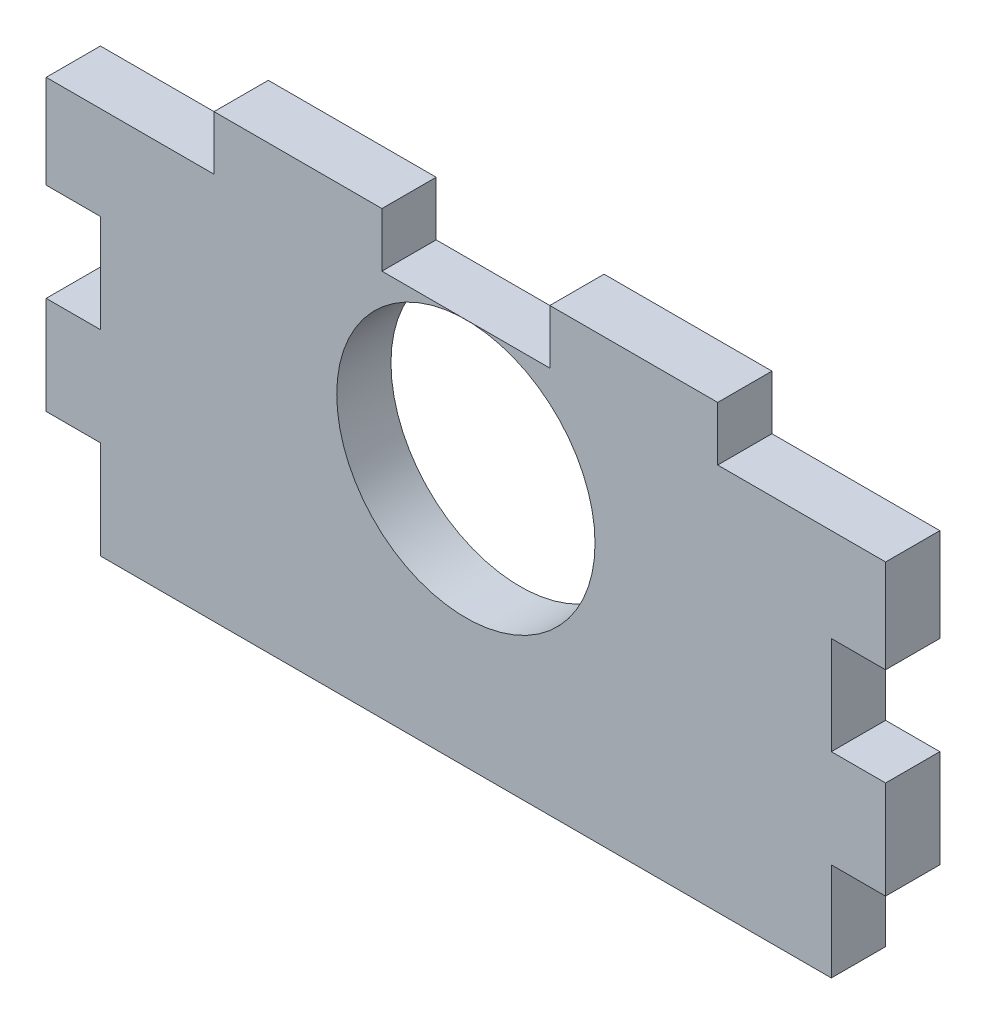
ISO-10303-21;
HEADER;
FILE_DESCRIPTION(('STEP AP214'),'2;1');
FILE_NAME('part.step','',(''),(''),'','','');
FILE_SCHEMA(('AUTOMOTIVE_DESIGN { 1 0 10303 214 1 1 1 1 }'));
ENDSEC;
DATA;
#1=APPLICATION_CONTEXT('core data for automotive mechanical design processes');
#2=APPLICATION_PROTOCOL_DEFINITION('international standard','automotive_design',2000,#1);
#3=PRODUCT_CONTEXT('',#1,'mechanical');
#4=PRODUCT('Part','Part','',(#3));
#5=PRODUCT_RELATED_PRODUCT_CATEGORY('part','',(#4));
#6=PRODUCT_DEFINITION_FORMATION('','',#4);
#7=PRODUCT_DEFINITION_CONTEXT('part definition',#1,'design');
#8=PRODUCT_DEFINITION('design','',#6,#7);
#9=PRODUCT_DEFINITION_SHAPE('','',#8);
#10=(LENGTH_UNIT() NAMED_UNIT(*) SI_UNIT(.MILLI.,.METRE.));
#11=(NAMED_UNIT(*) PLANE_ANGLE_UNIT() SI_UNIT($,.RADIAN.));
#12=(NAMED_UNIT(*) SI_UNIT($,.STERADIAN.) SOLID_ANGLE_UNIT());
#13=UNCERTAINTY_MEASURE_WITH_UNIT(LENGTH_MEASURE(1.E-05),#10,'distance_accuracy_value','');
#14=(GEOMETRIC_REPRESENTATION_CONTEXT(3) GLOBAL_UNCERTAINTY_ASSIGNED_CONTEXT((#13)) GLOBAL_UNIT_ASSIGNED_CONTEXT((#10,
#11,#12)) REPRESENTATION_CONTEXT('',''));
#15=CARTESIAN_POINT('',(0.,0.,0.));
#16=DIRECTION('',(0.,0.,1.));
#17=DIRECTION('',(1.,0.,0.));
#18=AXIS2_PLACEMENT_3D('',#15,#16,#17);
#19=CARTESIAN_POINT('',(-5.53524932452526,14.1108572179902,5.334));
#20=DIRECTION('',(-1.,0.,0.));
#21=DIRECTION('',(0.,0.,1.));
#22=AXIS2_PLACEMENT_3D('',#19,#20,#21);
#23=PLANE('',#22);
#24=DIRECTION('',(0.,1.,0.));
#25=VECTOR('',#24,1.);
#26=CARTESIAN_POINT('',(-5.53524932452526,14.1108572179902,5.334));
#27=LINE('',#26,#25);
#28=CARTESIAN_POINT('',(-5.53524932452527,-0.408183250673118,5.334));
#29=VERTEX_POINT('',#28);
#30=CARTESIAN_POINT('',(-5.53524932452526,8.77685721799016,5.334));
#31=VERTEX_POINT('',#30);
#32=EDGE_CURVE('E371',#29,#31,#27,.T.);
#33=ORIENTED_EDGE('',*,*,#32,.F.);
#34=DIRECTION('',(0.,0.,1.));
#35=VECTOR('',#34,1.);
#36=CARTESIAN_POINT('',(-5.53524932452527,-0.408183250673118,0.));
#37=LINE('',#36,#35);
#38=CARTESIAN_POINT('',(-5.53524932452527,-0.408183250673118,0.));
#39=VERTEX_POINT('',#38);
#40=EDGE_CURVE('E232',#39,#29,#37,.T.);
#41=ORIENTED_EDGE('',*,*,#40,.F.);
#42=DIRECTION('',(0.,1.,0.));
#43=VECTOR('',#42,1.);
#44=CARTESIAN_POINT('',(-5.53524932452526,14.1108572179902,0.));
#45=LINE('',#44,#43);
#46=CARTESIAN_POINT('',(-5.53524932452526,8.77685721799016,0.));
#47=VERTEX_POINT('',#46);
#48=EDGE_CURVE('E219',#39,#47,#45,.T.);
#49=ORIENTED_EDGE('',*,*,#48,.T.);
#50=DIRECTION('',(0.,0.,1.));
#51=VECTOR('',#50,1.);
#52=CARTESIAN_POINT('',(-5.53524932452526,8.77685721799016,0.));
#53=LINE('',#52,#51);
#54=EDGE_CURVE('E314',#47,#31,#53,.T.);
#55=ORIENTED_EDGE('',*,*,#54,.T.);
#56=EDGE_LOOP('',(#33,#41,#49,#55));
#57=FACE_BOUND('',#56,.T.);
#58=ADVANCED_FACE('F37',(#57),#23,.F.);
#59=CARTESIAN_POINT('',(-88.0852493245253,14.1108572179902,5.334));
#60=DIRECTION('',(1.,0.,0.));
#61=DIRECTION('',(0.,0.,-1.));
#62=AXIS2_PLACEMENT_3D('',#59,#60,#61);
#63=PLANE('',#62);
#64=DIRECTION('',(0.,-1.,0.));
#65=VECTOR('',#64,1.);
#66=CARTESIAN_POINT('',(-88.0852493245253,14.1108572179902,0.));
#67=LINE('',#66,#65);
#68=CARTESIAN_POINT('',(-88.0852493245253,8.77685721799016,0.));
#69=VERTEX_POINT('',#68);
#70=CARTESIAN_POINT('',(-88.0852493245253,-0.408183250673128,0.));
#71=VERTEX_POINT('',#70);
#72=EDGE_CURVE('E375',#69,#71,#67,.T.);
#73=ORIENTED_EDGE('',*,*,#72,.T.);
#74=DIRECTION('',(0.,0.,1.));
#75=VECTOR('',#74,1.);
#76=CARTESIAN_POINT('',(-88.0852493245253,-0.408183250673128,0.));
#77=LINE('',#76,#75);
#78=CARTESIAN_POINT('',(-88.0852493245253,-0.408183250673128,5.334));
#79=VERTEX_POINT('',#78);
#80=EDGE_CURVE('E272',#71,#79,#77,.T.);
#81=ORIENTED_EDGE('',*,*,#80,.T.);
#82=DIRECTION('',(0.,-1.,0.));
#83=VECTOR('',#82,1.);
#84=CARTESIAN_POINT('',(-88.0852493245253,14.1108572179902,5.334));
#85=LINE('',#84,#83);
#86=CARTESIAN_POINT('',(-88.0852493245253,8.77685721799016,5.334));
#87=VERTEX_POINT('',#86);
#88=EDGE_CURVE('E364',#87,#79,#85,.T.);
#89=ORIENTED_EDGE('',*,*,#88,.F.);
#90=DIRECTION('',(0.,0.,1.));
#91=VECTOR('',#90,1.);
#92=CARTESIAN_POINT('',(-88.0852493245253,8.77685721799016,0.));
#93=LINE('',#92,#91);
#94=EDGE_CURVE('E352',#69,#87,#93,.T.);
#95=ORIENTED_EDGE('',*,*,#94,.F.);
#96=EDGE_LOOP('',(#73,#81,#89,#95));
#97=FACE_BOUND('',#96,.T.);
#98=ADVANCED_FACE('F431',(#97),#63,.F.);
#99=CARTESIAN_POINT('',(-88.0852493245253,14.1108572179902,5.334));
#100=DIRECTION('',(0.,-1.,0.));
#101=DIRECTION('',(0.,0.,-1.));
#102=AXIS2_PLACEMENT_3D('',#99,#100,#101);
#103=PLANE('',#102);
#104=DIRECTION('',(-1.,0.,0.));
#105=VECTOR('',#104,1.);
#106=CARTESIAN_POINT('',(-88.0852493245253,14.1108572179902,5.334));
#107=LINE('',#106,#105);
#108=CARTESIAN_POINT('',(-55.0652493245253,14.1108572179902,5.334));
#109=VERTEX_POINT('',#108);
#110=CARTESIAN_POINT('',(-71.5752493245253,14.1108572179902,5.334));
#111=VERTEX_POINT('',#110);
#112=EDGE_CURVE('E46',#109,#111,#107,.T.);
#113=ORIENTED_EDGE('',*,*,#112,.F.);
#114=DIRECTION('',(0.,0.,1.));
#115=VECTOR('',#114,1.);
#116=CARTESIAN_POINT('',(-55.0652493245253,14.1108572179902,0.));
#117=LINE('',#116,#115);
#118=CARTESIAN_POINT('',(-55.0652493245253,14.1108572179902,0.));
#119=VERTEX_POINT('',#118);
#120=EDGE_CURVE('E336',#119,#109,#117,.T.);
#121=ORIENTED_EDGE('',*,*,#120,.F.);
#122=DIRECTION('',(-1.,0.,0.));
#123=VECTOR('',#122,1.);
#124=CARTESIAN_POINT('',(-88.0852493245253,14.1108572179902,0.));
#125=LINE('',#124,#123);
#126=CARTESIAN_POINT('',(-71.5752493245253,14.1108572179902,0.));
#127=VERTEX_POINT('',#126);
#128=EDGE_CURVE('E382',#119,#127,#125,.T.);
#129=ORIENTED_EDGE('',*,*,#128,.T.);
#130=DIRECTION('',(0.,0.,1.));
#131=VECTOR('',#130,1.);
#132=CARTESIAN_POINT('',(-71.5752493245253,14.1108572179902,0.));
#133=LINE('',#132,#131);
#134=EDGE_CURVE('E357',#127,#111,#133,.T.);
#135=ORIENTED_EDGE('',*,*,#134,.T.);
#136=EDGE_LOOP('',(#113,#121,#129,#135));
#137=FACE_BOUND('',#136,.T.);
#138=ADVANCED_FACE('F418',(#137),#103,.F.);
#139=CARTESIAN_POINT('',(-88.0852493245253,-10.046503094452,5.334));
#140=VERTEX_POINT('',#139);
#141=CARTESIAN_POINT('',(-88.0852493245253,-19.6848229382309,5.334));
#142=VERTEX_POINT('',#141);
#143=EDGE_CURVE('E368',#140,#142,#85,.T.);
#144=ORIENTED_EDGE('',*,*,#143,.F.);
#145=DIRECTION('',(0.,0.,1.));
#146=VECTOR('',#145,1.);
#147=CARTESIAN_POINT('',(-88.0852493245253,-10.046503094452,0.));
#148=LINE('',#147,#146);
#149=CARTESIAN_POINT('',(-88.0852493245253,-10.046503094452,0.));
#150=VERTEX_POINT('',#149);
#151=EDGE_CURVE('E265',#150,#140,#148,.T.);
#152=ORIENTED_EDGE('',*,*,#151,.F.);
#153=CARTESIAN_POINT('',(-88.0852493245253,-19.6848229382309,0.));
#154=VERTEX_POINT('',#153);
#155=EDGE_CURVE('E360',#150,#154,#67,.T.);
#156=ORIENTED_EDGE('',*,*,#155,.T.);
#157=DIRECTION('',(0.,0.,1.));
#158=VECTOR('',#157,1.);
#159=CARTESIAN_POINT('',(-88.0852493245253,-19.6848229382309,0.));
#160=LINE('',#159,#158);
#161=EDGE_CURVE('E293',#154,#142,#160,.T.);
#162=ORIENTED_EDGE('',*,*,#161,.T.);
#163=EDGE_LOOP('',(#144,#152,#156,#162));
#164=FACE_BOUND('',#163,.T.);
#165=ADVANCED_FACE('F39',(#164),#63,.F.);
#166=CARTESIAN_POINT('',(-88.0852493245253,-29.3231427820098,5.334));
#167=DIRECTION('',(0.,1.,0.));
#168=DIRECTION('',(0.,0.,1.));
#169=AXIS2_PLACEMENT_3D('',#166,#167,#168);
#170=PLANE('',#169);
#171=DIRECTION('',(1.,0.,0.));
#172=VECTOR('',#171,1.);
#173=CARTESIAN_POINT('',(-88.0852493245253,-29.3231427820098,0.));
#174=LINE('',#173,#172);
#175=CARTESIAN_POINT('',(-82.7512493245252,-29.3231427820098,0.));
#176=VERTEX_POINT('',#175);
#177=CARTESIAN_POINT('',(-10.8692493245253,-29.3231427820098,0.));
#178=VERTEX_POINT('',#177);
#179=EDGE_CURVE('E378',#176,#178,#174,.T.);
#180=ORIENTED_EDGE('',*,*,#179,.T.);
#181=DIRECTION('',(0.,0.,1.));
#182=VECTOR('',#181,1.);
#183=CARTESIAN_POINT('',(-10.8692493245253,-29.3231427820098,0.));
#184=LINE('',#183,#182);
#185=CARTESIAN_POINT('',(-10.8692493245253,-29.3231427820098,5.334));
#186=VERTEX_POINT('',#185);
#187=EDGE_CURVE('E248',#178,#186,#184,.T.);
#188=ORIENTED_EDGE('',*,*,#187,.T.);
#189=DIRECTION('',(1.,0.,0.));
#190=VECTOR('',#189,1.);
#191=CARTESIAN_POINT('',(-88.0852493245253,-29.3231427820098,5.334));
#192=LINE('',#191,#190);
#193=CARTESIAN_POINT('',(-82.7512493245252,-29.3231427820098,5.334));
#194=VERTEX_POINT('',#193);
#195=EDGE_CURVE('E367',#194,#186,#192,.T.);
#196=ORIENTED_EDGE('',*,*,#195,.F.);
#197=DIRECTION('',(0.,0.,1.));
#198=VECTOR('',#197,1.);
#199=CARTESIAN_POINT('',(-82.7512493245252,-29.3231427820098,0.));
#200=LINE('',#199,#198);
#201=EDGE_CURVE('E288',#176,#194,#200,.T.);
#202=ORIENTED_EDGE('',*,*,#201,.F.);
#203=EDGE_LOOP('',(#180,#188,#196,#202));
#204=FACE_BOUND('',#203,.T.);
#205=ADVANCED_FACE('F459',(#204),#170,.F.);
#206=CARTESIAN_POINT('',(-5.53524932452526,-19.6848229382309,0.));
#207=VERTEX_POINT('',#206);
#208=CARTESIAN_POINT('',(-5.53524932452527,-10.046503094452,0.));
#209=VERTEX_POINT('',#208);
#210=EDGE_CURVE('E380',#207,#209,#45,.T.);
#211=ORIENTED_EDGE('',*,*,#210,.T.);
#212=DIRECTION('',(0.,0.,1.));
#213=VECTOR('',#212,1.);
#214=CARTESIAN_POINT('',(-5.53524932452527,-10.046503094452,0.));
#215=LINE('',#214,#213);
#216=CARTESIAN_POINT('',(-5.53524932452527,-10.046503094452,5.334));
#217=VERTEX_POINT('',#216);
#218=EDGE_CURVE('E235',#209,#217,#215,.T.);
#219=ORIENTED_EDGE('',*,*,#218,.T.);
#220=CARTESIAN_POINT('',(-5.53524932452526,-19.6848229382309,5.334));
#221=VERTEX_POINT('',#220);
#222=EDGE_CURVE('E372',#221,#217,#27,.T.);
#223=ORIENTED_EDGE('',*,*,#222,.F.);
#224=DIRECTION('',(0.,0.,1.));
#225=VECTOR('',#224,1.);
#226=CARTESIAN_POINT('',(-5.53524932452526,-19.6848229382309,0.));
#227=LINE('',#226,#225);
#228=EDGE_CURVE('E244',#207,#221,#227,.T.);
#229=ORIENTED_EDGE('',*,*,#228,.F.);
#230=EDGE_LOOP('',(#211,#219,#223,#229));
#231=FACE_BOUND('',#230,.T.);
#232=ADVANCED_FACE('F466',(#231),#23,.F.);
#233=CARTESIAN_POINT('',(-22.0452493245253,14.1108572179902,5.334));
#234=VERTEX_POINT('',#233);
#235=CARTESIAN_POINT('',(-38.5552493245253,14.1108572179902,5.334));
#236=VERTEX_POINT('',#235);
#237=EDGE_CURVE('E11',#234,#236,#107,.T.);
#238=ORIENTED_EDGE('',*,*,#237,.F.);
#239=DIRECTION('',(0.,0.,1.));
#240=VECTOR('',#239,1.);
#241=CARTESIAN_POINT('',(-22.0452493245253,14.1108572179902,0.));
#242=LINE('',#241,#240);
#243=CARTESIAN_POINT('',(-22.0452493245253,14.1108572179902,0.));
#244=VERTEX_POINT('',#243);
#245=EDGE_CURVE('E311',#244,#234,#242,.T.);
#246=ORIENTED_EDGE('',*,*,#245,.F.);
#247=CARTESIAN_POINT('',(-38.5552493245253,14.1108572179902,0.));
#248=VERTEX_POINT('',#247);
#249=EDGE_CURVE('E41',#244,#248,#125,.T.);
#250=ORIENTED_EDGE('',*,*,#249,.T.);
#251=DIRECTION('',(0.,0.,1.));
#252=VECTOR('',#251,1.);
#253=CARTESIAN_POINT('',(-38.5552493245253,14.1108572179902,0.));
#254=LINE('',#253,#252);
#255=EDGE_CURVE('E339',#248,#236,#254,.T.);
#256=ORIENTED_EDGE('',*,*,#255,.T.);
#257=EDGE_LOOP('',(#238,#246,#250,#256));
#258=FACE_BOUND('',#257,.T.);
#259=ADVANCED_FACE('F400',(#258),#103,.F.);
#260=CARTESIAN_POINT('',(0.,0.,5.334));
#261=DIRECTION('',(0.,0.,1.));
#262=DIRECTION('',(1.,0.,0.));
#263=AXIS2_PLACEMENT_3D('',#260,#261,#262);
#264=PLANE('',#263);
#265=CARTESIAN_POINT('',(-46.8102493245253,-3.92339678200984,5.334));
#266=DIRECTION('',(0.,0.,1.));
#267=DIRECTION('',(1.,0.,0.));
#268=AXIS2_PLACEMENT_3D('',#265,#266,#267);
#269=CIRCLE('',#268,12.7);
#270=CARTESIAN_POINT('',(-34.1102493245252,-3.92339678200984,5.334));
#271=VERTEX_POINT('',#270);
#272=EDGE_CURVE('E225',#271,#271,#269,.T.);
#273=ORIENTED_EDGE('',*,*,#272,.F.);
#274=EDGE_LOOP('',(#273));
#275=FACE_BOUND('',#274,.T.);
#276=DIRECTION('',(-1.,0.,0.));
#277=VECTOR('',#276,1.);
#278=CARTESIAN_POINT('',(-5.53524932452527,-0.408183250673118,5.334));
#279=LINE('',#278,#277);
#280=CARTESIAN_POINT('',(-10.8692493245253,-0.408183250673119,5.334));
#281=VERTEX_POINT('',#280);
#282=EDGE_CURVE('E205',#29,#281,#279,.T.);
#283=ORIENTED_EDGE('',*,*,#282,.F.);
#284=ORIENTED_EDGE('',*,*,#32,.T.);
#285=DIRECTION('',(1.,0.,0.));
#286=VECTOR('',#285,1.);
#287=CARTESIAN_POINT('',(-22.0452493245253,8.77685721799016,5.334));
#288=LINE('',#287,#286);
#289=CARTESIAN_POINT('',(-22.0452493245253,8.77685721799016,5.334));
#290=VERTEX_POINT('',#289);
#291=EDGE_CURVE('E304',#290,#31,#288,.T.);
#292=ORIENTED_EDGE('',*,*,#291,.F.);
#293=DIRECTION('',(0.,-1.,0.));
#294=VECTOR('',#293,1.);
#295=CARTESIAN_POINT('',(-22.0452493245253,14.1108572179902,5.334));
#296=LINE('',#295,#294);
#297=EDGE_CURVE('E296',#234,#290,#296,.T.);
#298=ORIENTED_EDGE('',*,*,#297,.F.);
#299=ORIENTED_EDGE('',*,*,#237,.T.);
#300=DIRECTION('',(0.,1.,0.));
#301=VECTOR('',#300,1.);
#302=CARTESIAN_POINT('',(-38.5552493245253,14.1108572179902,5.334));
#303=LINE('',#302,#301);
#304=CARTESIAN_POINT('',(-38.5552493245253,8.77685721799016,5.334));
#305=VERTEX_POINT('',#304);
#306=EDGE_CURVE('E322',#305,#236,#303,.T.);
#307=ORIENTED_EDGE('',*,*,#306,.F.);
#308=DIRECTION('',(1.,0.,0.));
#309=VECTOR('',#308,1.);
#310=CARTESIAN_POINT('',(-55.0652493245253,8.77685721799016,5.334));
#311=LINE('',#310,#309);
#312=CARTESIAN_POINT('',(-55.0652493245253,8.77685721799016,5.334));
#313=VERTEX_POINT('',#312);
#314=EDGE_CURVE('E331',#313,#305,#311,.T.);
#315=ORIENTED_EDGE('',*,*,#314,.F.);
#316=DIRECTION('',(0.,-1.,0.));
#317=VECTOR('',#316,1.);
#318=CARTESIAN_POINT('',(-55.0652493245253,14.1108572179902,5.334));
#319=LINE('',#318,#317);
#320=EDGE_CURVE('E313',#109,#313,#319,.T.);
#321=ORIENTED_EDGE('',*,*,#320,.F.);
#322=ORIENTED_EDGE('',*,*,#112,.T.);
#323=DIRECTION('',(0.,1.,0.));
#324=VECTOR('',#323,1.);
#325=CARTESIAN_POINT('',(-71.5752493245253,14.1108572179902,5.334));
#326=LINE('',#325,#324);
#327=CARTESIAN_POINT('',(-71.5752493245253,8.77685721799016,5.334));
#328=VERTEX_POINT('',#327);
#329=EDGE_CURVE('E349',#328,#111,#326,.T.);
#330=ORIENTED_EDGE('',*,*,#329,.F.);
#331=DIRECTION('',(1.,0.,0.));
#332=VECTOR('',#331,1.);
#333=CARTESIAN_POINT('',(-88.0852493245253,8.77685721799016,5.334));
#334=LINE('',#333,#332);
#335=EDGE_CURVE('E338',#87,#328,#334,.T.);
#336=ORIENTED_EDGE('',*,*,#335,.F.);
#337=ORIENTED_EDGE('',*,*,#88,.T.);
#338=DIRECTION('',(-1.,0.,0.));
#339=VECTOR('',#338,1.);
#340=CARTESIAN_POINT('',(-88.0852493245253,-0.408183250673128,5.334));
#341=LINE('',#340,#339);
#342=CARTESIAN_POINT('',(-82.7512493245252,-0.408183250673128,5.334));
#343=VERTEX_POINT('',#342);
#344=EDGE_CURVE('E259',#343,#79,#341,.T.);
#345=ORIENTED_EDGE('',*,*,#344,.F.);
#346=DIRECTION('',(0.,1.,0.));
#347=VECTOR('',#346,1.);
#348=CARTESIAN_POINT('',(-82.7512493245252,-0.408183250673128,5.334));
#349=LINE('',#348,#347);
#350=CARTESIAN_POINT('',(-82.7512493245252,-10.046503094452,5.334));
#351=VERTEX_POINT('',#350);
#352=EDGE_CURVE('E268',#351,#343,#349,.T.);
#353=ORIENTED_EDGE('',*,*,#352,.F.);
#354=DIRECTION('',(1.,0.,0.));
#355=VECTOR('',#354,1.);
#356=CARTESIAN_POINT('',(-88.0852493245253,-10.046503094452,5.334));
#357=LINE('',#356,#355);
#358=EDGE_CURVE('E251',#140,#351,#357,.T.);
#359=ORIENTED_EDGE('',*,*,#358,.F.);
#360=ORIENTED_EDGE('',*,*,#143,.T.);
#361=DIRECTION('',(-1.,0.,0.));
#362=VECTOR('',#361,1.);
#363=CARTESIAN_POINT('',(-88.0852493245253,-19.6848229382309,5.334));
#364=LINE('',#363,#362);
#365=CARTESIAN_POINT('',(-82.7512493245252,-19.6848229382309,5.334));
#366=VERTEX_POINT('',#365);
#367=EDGE_CURVE('E285',#366,#142,#364,.T.);
#368=ORIENTED_EDGE('',*,*,#367,.F.);
#369=DIRECTION('',(0.,1.,0.));
#370=VECTOR('',#369,1.);
#371=CARTESIAN_POINT('',(-82.7512493245252,-29.3231427820098,5.334));
#372=LINE('',#371,#370);
#373=EDGE_CURVE('E275',#194,#366,#372,.T.);
#374=ORIENTED_EDGE('',*,*,#373,.F.);
#375=ORIENTED_EDGE('',*,*,#195,.T.);
#376=DIRECTION('',(0.,-1.,0.));
#377=VECTOR('',#376,1.);
#378=CARTESIAN_POINT('',(-10.8692493245253,-29.3231427820098,5.334));
#379=LINE('',#378,#377);
#380=CARTESIAN_POINT('',(-10.8692493245253,-19.6848229382309,5.334));
#381=VERTEX_POINT('',#380);
#382=EDGE_CURVE('E242',#381,#186,#379,.T.);
#383=ORIENTED_EDGE('',*,*,#382,.F.);
#384=DIRECTION('',(-1.,0.,0.));
#385=VECTOR('',#384,1.);
#386=CARTESIAN_POINT('',(-5.53524932452526,-19.6848229382309,5.334));
#387=LINE('',#386,#385);
#388=EDGE_CURVE('E234',#221,#381,#387,.T.);
#389=ORIENTED_EDGE('',*,*,#388,.F.);
#390=ORIENTED_EDGE('',*,*,#222,.T.);
#391=DIRECTION('',(1.,0.,0.));
#392=VECTOR('',#391,1.);
#393=CARTESIAN_POINT('',(-5.53524932452527,-10.046503094452,5.334));
#394=LINE('',#393,#392);
#395=CARTESIAN_POINT('',(-10.8692493245253,-10.046503094452,5.334));
#396=VERTEX_POINT('',#395);
#397=EDGE_CURVE('E220',#396,#217,#394,.T.);
#398=ORIENTED_EDGE('',*,*,#397,.F.);
#399=DIRECTION('',(0.,-1.,0.));
#400=VECTOR('',#399,1.);
#401=CARTESIAN_POINT('',(-10.8692493245253,-0.408183250673119,5.334));
#402=LINE('',#401,#400);
#403=EDGE_CURVE('E222',#281,#396,#402,.T.);
#404=ORIENTED_EDGE('',*,*,#403,.F.);
#405=EDGE_LOOP('',(#283,#284,#292,#298,#299,#307,#315,#321,#322,#330,#336,#337,#345,#353,#359,
#360,#368,#374,#375,#383,#389,#390,#398,#404));
#406=FACE_BOUND('',#405,.T.);
#407=ADVANCED_FACE('F404',(#275,#406),#264,.T.);
#408=CARTESIAN_POINT('',(0.,0.,0.));
#409=DIRECTION('',(0.,0.,1.));
#410=DIRECTION('',(1.,0.,0.));
#411=AXIS2_PLACEMENT_3D('',#408,#409,#410);
#412=PLANE('',#411);
#413=CARTESIAN_POINT('',(-46.8102493245253,-3.92339678200984,0.));
#414=DIRECTION('',(0.,0.,1.));
#415=DIRECTION('',(1.,0.,0.));
#416=AXIS2_PLACEMENT_3D('',#413,#414,#415);
#417=CIRCLE('',#416,12.7);
#418=CARTESIAN_POINT('',(-34.1102493245252,-3.92339678200984,0.));
#419=VERTEX_POINT('',#418);
#420=EDGE_CURVE('E230',#419,#419,#417,.T.);
#421=ORIENTED_EDGE('',*,*,#420,.T.);
#422=EDGE_LOOP('',(#421));
#423=FACE_BOUND('',#422,.T.);
#424=ORIENTED_EDGE('',*,*,#48,.F.);
#425=DIRECTION('',(-1.,0.,0.));
#426=VECTOR('',#425,1.);
#427=CARTESIAN_POINT('',(-5.53524932452527,-0.408183250673118,0.));
#428=LINE('',#427,#426);
#429=CARTESIAN_POINT('',(-10.8692493245253,-0.408183250673119,0.));
#430=VERTEX_POINT('',#429);
#431=EDGE_CURVE('E202',#39,#430,#428,.T.);
#432=ORIENTED_EDGE('',*,*,#431,.T.);
#433=DIRECTION('',(0.,-1.,0.));
#434=VECTOR('',#433,1.);
#435=CARTESIAN_POINT('',(-10.8692493245253,-0.408183250673119,0.));
#436=LINE('',#435,#434);
#437=CARTESIAN_POINT('',(-10.8692493245253,-10.046503094452,0.));
#438=VERTEX_POINT('',#437);
#439=EDGE_CURVE('E212',#430,#438,#436,.T.);
#440=ORIENTED_EDGE('',*,*,#439,.T.);
#441=DIRECTION('',(1.,0.,0.));
#442=VECTOR('',#441,1.);
#443=CARTESIAN_POINT('',(-5.53524932452527,-10.046503094452,0.));
#444=LINE('',#443,#442);
#445=EDGE_CURVE('E54',#438,#209,#444,.T.);
#446=ORIENTED_EDGE('',*,*,#445,.T.);
#447=ORIENTED_EDGE('',*,*,#210,.F.);
#448=DIRECTION('',(-1.,0.,0.));
#449=VECTOR('',#448,1.);
#450=CARTESIAN_POINT('',(-5.53524932452526,-19.6848229382309,0.));
#451=LINE('',#450,#449);
#452=CARTESIAN_POINT('',(-10.8692493245253,-19.6848229382309,0.));
#453=VERTEX_POINT('',#452);
#454=EDGE_CURVE('E239',#207,#453,#451,.T.);
#455=ORIENTED_EDGE('',*,*,#454,.T.);
#456=DIRECTION('',(0.,-1.,0.));
#457=VECTOR('',#456,1.);
#458=CARTESIAN_POINT('',(-10.8692493245253,-29.3231427820098,0.));
#459=LINE('',#458,#457);
#460=EDGE_CURVE('E62',#453,#178,#459,.T.);
#461=ORIENTED_EDGE('',*,*,#460,.T.);
#462=ORIENTED_EDGE('',*,*,#179,.F.);
#463=DIRECTION('',(0.,1.,0.));
#464=VECTOR('',#463,1.);
#465=CARTESIAN_POINT('',(-82.7512493245252,-29.3231427820098,0.));
#466=LINE('',#465,#464);
#467=CARTESIAN_POINT('',(-82.7512493245252,-19.6848229382309,0.));
#468=VERTEX_POINT('',#467);
#469=EDGE_CURVE('E281',#176,#468,#466,.T.);
#470=ORIENTED_EDGE('',*,*,#469,.T.);
#471=DIRECTION('',(-1.,0.,0.));
#472=VECTOR('',#471,1.);
#473=CARTESIAN_POINT('',(-88.0852493245253,-19.6848229382309,0.));
#474=LINE('',#473,#472);
#475=EDGE_CURVE('E284',#468,#154,#474,.T.);
#476=ORIENTED_EDGE('',*,*,#475,.T.);
#477=ORIENTED_EDGE('',*,*,#155,.F.);
#478=DIRECTION('',(1.,0.,0.));
#479=VECTOR('',#478,1.);
#480=CARTESIAN_POINT('',(-88.0852493245253,-10.046503094452,0.));
#481=LINE('',#480,#479);
#482=CARTESIAN_POINT('',(-82.7512493245252,-10.046503094452,0.));
#483=VERTEX_POINT('',#482);
#484=EDGE_CURVE('E255',#150,#483,#481,.T.);
#485=ORIENTED_EDGE('',*,*,#484,.T.);
#486=DIRECTION('',(0.,1.,0.));
#487=VECTOR('',#486,1.);
#488=CARTESIAN_POINT('',(-82.7512493245252,-0.408183250673128,0.));
#489=LINE('',#488,#487);
#490=CARTESIAN_POINT('',(-82.7512493245252,-0.408183250673128,0.));
#491=VERTEX_POINT('',#490);
#492=EDGE_CURVE('E258',#483,#491,#489,.T.);
#493=ORIENTED_EDGE('',*,*,#492,.T.);
#494=DIRECTION('',(-1.,0.,0.));
#495=VECTOR('',#494,1.);
#496=CARTESIAN_POINT('',(-88.0852493245253,-0.408183250673128,0.));
#497=LINE('',#496,#495);
#498=EDGE_CURVE('E262',#491,#71,#497,.T.);
#499=ORIENTED_EDGE('',*,*,#498,.T.);
#500=ORIENTED_EDGE('',*,*,#72,.F.);
#501=DIRECTION('',(1.,0.,0.));
#502=VECTOR('',#501,1.);
#503=CARTESIAN_POINT('',(-88.0852493245253,8.77685721799016,0.));
#504=LINE('',#503,#502);
#505=CARTESIAN_POINT('',(-71.5752493245253,8.77685721799016,0.));
#506=VERTEX_POINT('',#505);
#507=EDGE_CURVE('E345',#69,#506,#504,.T.);
#508=ORIENTED_EDGE('',*,*,#507,.T.);
#509=DIRECTION('',(0.,1.,0.));
#510=VECTOR('',#509,1.);
#511=CARTESIAN_POINT('',(-71.5752493245253,14.1108572179902,0.));
#512=LINE('',#511,#510);
#513=EDGE_CURVE('E348',#506,#127,#512,.T.);
#514=ORIENTED_EDGE('',*,*,#513,.T.);
#515=ORIENTED_EDGE('',*,*,#128,.F.);
#516=DIRECTION('',(0.,-1.,0.));
#517=VECTOR('',#516,1.);
#518=CARTESIAN_POINT('',(-55.0652493245253,14.1108572179902,0.));
#519=LINE('',#518,#517);
#520=CARTESIAN_POINT('',(-55.0652493245253,8.77685721799016,0.));
#521=VERTEX_POINT('',#520);
#522=EDGE_CURVE('E318',#119,#521,#519,.T.);
#523=ORIENTED_EDGE('',*,*,#522,.T.);
#524=DIRECTION('',(1.,0.,0.));
#525=VECTOR('',#524,1.);
#526=CARTESIAN_POINT('',(-55.0652493245253,8.77685721799016,0.));
#527=LINE('',#526,#525);
#528=CARTESIAN_POINT('',(-38.5552493245253,8.77685721799016,0.));
#529=VERTEX_POINT('',#528);
#530=EDGE_CURVE('E321',#521,#529,#527,.T.);
#531=ORIENTED_EDGE('',*,*,#530,.T.);
#532=DIRECTION('',(0.,1.,0.));
#533=VECTOR('',#532,1.);
#534=CARTESIAN_POINT('',(-38.5552493245253,14.1108572179902,0.));
#535=LINE('',#534,#533);
#536=EDGE_CURVE('E325',#529,#248,#535,.T.);
#537=ORIENTED_EDGE('',*,*,#536,.T.);
#538=ORIENTED_EDGE('',*,*,#249,.F.);
#539=DIRECTION('',(0.,-1.,0.));
#540=VECTOR('',#539,1.);
#541=CARTESIAN_POINT('',(-22.0452493245253,14.1108572179902,0.));
#542=LINE('',#541,#540);
#543=CARTESIAN_POINT('',(-22.0452493245253,8.77685721799016,0.));
#544=VERTEX_POINT('',#543);
#545=EDGE_CURVE('E300',#244,#544,#542,.T.);
#546=ORIENTED_EDGE('',*,*,#545,.T.);
#547=DIRECTION('',(1.,0.,0.));
#548=VECTOR('',#547,1.);
#549=CARTESIAN_POINT('',(-22.0452493245253,8.77685721799016,0.));
#550=LINE('',#549,#548);
#551=EDGE_CURVE('E303',#544,#47,#550,.T.);
#552=ORIENTED_EDGE('',*,*,#551,.T.);
#553=EDGE_LOOP('',(#424,#432,#440,#446,#447,#455,#461,#462,#470,#476,#477,#485,#493,#499,#500,
#508,#514,#515,#523,#531,#537,#538,#546,#552));
#554=FACE_BOUND('',#553,.T.);
#555=ADVANCED_FACE('F217',(#423,#554),#412,.F.);
#556=CARTESIAN_POINT('',(-71.5752493245253,14.1108572179902,0.));
#557=DIRECTION('',(1.,0.,0.));
#558=DIRECTION('',(0.,0.,-1.));
#559=AXIS2_PLACEMENT_3D('',#556,#557,#558);
#560=PLANE('',#559);
#561=ORIENTED_EDGE('',*,*,#329,.T.);
#562=ORIENTED_EDGE('',*,*,#134,.F.);
#563=ORIENTED_EDGE('',*,*,#513,.F.);
#564=DIRECTION('',(0.,0.,1.));
#565=VECTOR('',#564,1.);
#566=CARTESIAN_POINT('',(-71.5752493245253,8.77685721799016,0.));
#567=LINE('',#566,#565);
#568=EDGE_CURVE('E361',#506,#328,#567,.T.);
#569=ORIENTED_EDGE('',*,*,#568,.T.);
#570=EDGE_LOOP('',(#561,#562,#563,#569));
#571=FACE_BOUND('',#570,.T.);
#572=ADVANCED_FACE('F422',(#571),#560,.F.);
#573=CARTESIAN_POINT('',(-88.0852493245253,8.77685721799016,0.));
#574=DIRECTION('',(0.,-1.,0.));
#575=DIRECTION('',(0.,0.,-1.));
#576=AXIS2_PLACEMENT_3D('',#573,#574,#575);
#577=PLANE('',#576);
#578=ORIENTED_EDGE('',*,*,#335,.T.);
#579=ORIENTED_EDGE('',*,*,#568,.F.);
#580=ORIENTED_EDGE('',*,*,#507,.F.);
#581=ORIENTED_EDGE('',*,*,#94,.T.);
#582=EDGE_LOOP('',(#578,#579,#580,#581));
#583=FACE_BOUND('',#582,.T.);
#584=ADVANCED_FACE('F427',(#583),#577,.F.);
#585=CARTESIAN_POINT('',(-55.0652493245253,14.1108572179902,0.));
#586=DIRECTION('',(-1.,0.,0.));
#587=DIRECTION('',(0.,0.,1.));
#588=AXIS2_PLACEMENT_3D('',#585,#586,#587);
#589=PLANE('',#588);
#590=ORIENTED_EDGE('',*,*,#320,.T.);
#591=DIRECTION('',(0.,0.,1.));
#592=VECTOR('',#591,1.);
#593=CARTESIAN_POINT('',(-55.0652493245253,8.77685721799016,0.));
#594=LINE('',#593,#592);
#595=EDGE_CURVE('E328',#521,#313,#594,.T.);
#596=ORIENTED_EDGE('',*,*,#595,.F.);
#597=ORIENTED_EDGE('',*,*,#522,.F.);
#598=ORIENTED_EDGE('',*,*,#120,.T.);
#599=EDGE_LOOP('',(#590,#596,#597,#598));
#600=FACE_BOUND('',#599,.T.);
#601=ADVANCED_FACE('F507',(#600),#589,.F.);
#602=CARTESIAN_POINT('',(-38.5552493245253,14.1108572179902,0.));
#603=DIRECTION('',(1.,0.,0.));
#604=DIRECTION('',(0.,0.,-1.));
#605=AXIS2_PLACEMENT_3D('',#602,#603,#604);
#606=PLANE('',#605);
#607=ORIENTED_EDGE('',*,*,#306,.T.);
#608=ORIENTED_EDGE('',*,*,#255,.F.);
#609=ORIENTED_EDGE('',*,*,#536,.F.);
#610=DIRECTION('',(0.,0.,1.));
#611=VECTOR('',#610,1.);
#612=CARTESIAN_POINT('',(-38.5552493245253,8.77685721799016,0.));
#613=LINE('',#612,#611);
#614=EDGE_CURVE('E342',#529,#305,#613,.T.);
#615=ORIENTED_EDGE('',*,*,#614,.T.);
#616=EDGE_LOOP('',(#607,#608,#609,#615));
#617=FACE_BOUND('',#616,.T.);
#618=ADVANCED_FACE('F407',(#617),#606,.F.);
#619=CARTESIAN_POINT('',(-55.0652493245253,8.77685721799016,0.));
#620=DIRECTION('',(0.,-1.,0.));
#621=DIRECTION('',(0.,0.,-1.));
#622=AXIS2_PLACEMENT_3D('',#619,#620,#621);
#623=PLANE('',#622);
#624=ORIENTED_EDGE('',*,*,#314,.T.);
#625=ORIENTED_EDGE('',*,*,#614,.F.);
#626=ORIENTED_EDGE('',*,*,#530,.F.);
#627=ORIENTED_EDGE('',*,*,#595,.T.);
#628=EDGE_LOOP('',(#624,#625,#626,#627));
#629=FACE_BOUND('',#628,.T.);
#630=ADVANCED_FACE('F411',(#629),#623,.F.);
#631=CARTESIAN_POINT('',(-22.0452493245253,14.1108572179902,0.));
#632=DIRECTION('',(-1.,0.,0.));
#633=DIRECTION('',(0.,0.,1.));
#634=AXIS2_PLACEMENT_3D('',#631,#632,#633);
#635=PLANE('',#634);
#636=ORIENTED_EDGE('',*,*,#297,.T.);
#637=DIRECTION('',(0.,0.,1.));
#638=VECTOR('',#637,1.);
#639=CARTESIAN_POINT('',(-22.0452493245253,8.77685721799016,0.));
#640=LINE('',#639,#638);
#641=EDGE_CURVE('E306',#544,#290,#640,.T.);
#642=ORIENTED_EDGE('',*,*,#641,.F.);
#643=ORIENTED_EDGE('',*,*,#545,.F.);
#644=ORIENTED_EDGE('',*,*,#245,.T.);
#645=EDGE_LOOP('',(#636,#642,#643,#644));
#646=FACE_BOUND('',#645,.T.);
#647=ADVANCED_FACE('F396',(#646),#635,.F.);
#648=CARTESIAN_POINT('',(-22.0452493245253,8.77685721799016,0.));
#649=DIRECTION('',(0.,-1.,0.));
#650=DIRECTION('',(0.,0.,-1.));
#651=AXIS2_PLACEMENT_3D('',#648,#649,#650);
#652=PLANE('',#651);
#653=ORIENTED_EDGE('',*,*,#291,.T.);
#654=ORIENTED_EDGE('',*,*,#54,.F.);
#655=ORIENTED_EDGE('',*,*,#551,.F.);
#656=ORIENTED_EDGE('',*,*,#641,.T.);
#657=EDGE_LOOP('',(#653,#654,#655,#656));
#658=FACE_BOUND('',#657,.T.);
#659=ADVANCED_FACE('F391',(#658),#652,.F.);
#660=CARTESIAN_POINT('',(-88.0852493245253,-19.6848229382309,0.));
#661=DIRECTION('',(0.,1.,0.));
#662=DIRECTION('',(0.,0.,1.));
#663=AXIS2_PLACEMENT_3D('',#660,#661,#662);
#664=PLANE('',#663);
#665=ORIENTED_EDGE('',*,*,#367,.T.);
#666=ORIENTED_EDGE('',*,*,#161,.F.);
#667=ORIENTED_EDGE('',*,*,#475,.F.);
#668=DIRECTION('',(0.,0.,1.));
#669=VECTOR('',#668,1.);
#670=CARTESIAN_POINT('',(-82.7512493245252,-19.6848229382309,0.));
#671=LINE('',#670,#669);
#672=EDGE_CURVE('E297',#468,#366,#671,.T.);
#673=ORIENTED_EDGE('',*,*,#672,.T.);
#674=EDGE_LOOP('',(#665,#666,#667,#673));
#675=FACE_BOUND('',#674,.T.);
#676=ADVANCED_FACE('F450',(#675),#664,.F.);
#677=CARTESIAN_POINT('',(-82.7512493245252,-29.3231427820098,0.));
#678=DIRECTION('',(1.,0.,0.));
#679=DIRECTION('',(0.,0.,-1.));
#680=AXIS2_PLACEMENT_3D('',#677,#678,#679);
#681=PLANE('',#680);
#682=ORIENTED_EDGE('',*,*,#373,.T.);
#683=ORIENTED_EDGE('',*,*,#672,.F.);
#684=ORIENTED_EDGE('',*,*,#469,.F.);
#685=ORIENTED_EDGE('',*,*,#201,.T.);
#686=EDGE_LOOP('',(#682,#683,#684,#685));
#687=FACE_BOUND('',#686,.T.);
#688=ADVANCED_FACE('F455',(#687),#681,.F.);
#689=CARTESIAN_POINT('',(-88.0852493245253,-0.408183250673128,0.));
#690=DIRECTION('',(0.,1.,0.));
#691=DIRECTION('',(0.,0.,1.));
#692=AXIS2_PLACEMENT_3D('',#689,#690,#691);
#693=PLANE('',#692);
#694=ORIENTED_EDGE('',*,*,#344,.T.);
#695=ORIENTED_EDGE('',*,*,#80,.F.);
#696=ORIENTED_EDGE('',*,*,#498,.F.);
#697=DIRECTION('',(0.,0.,1.));
#698=VECTOR('',#697,1.);
#699=CARTESIAN_POINT('',(-82.7512493245252,-0.408183250673128,0.));
#700=LINE('',#699,#698);
#701=EDGE_CURVE('E276',#491,#343,#700,.T.);
#702=ORIENTED_EDGE('',*,*,#701,.T.);
#703=EDGE_LOOP('',(#694,#695,#696,#702));
#704=FACE_BOUND('',#703,.T.);
#705=ADVANCED_FACE('F436',(#704),#693,.F.);
#706=CARTESIAN_POINT('',(-82.7512493245252,-0.408183250673128,0.));
#707=DIRECTION('',(1.,0.,0.));
#708=DIRECTION('',(0.,0.,-1.));
#709=AXIS2_PLACEMENT_3D('',#706,#707,#708);
#710=PLANE('',#709);
#711=ORIENTED_EDGE('',*,*,#352,.T.);
#712=ORIENTED_EDGE('',*,*,#701,.F.);
#713=ORIENTED_EDGE('',*,*,#492,.F.);
#714=DIRECTION('',(0.,0.,1.));
#715=VECTOR('',#714,1.);
#716=CARTESIAN_POINT('',(-82.7512493245252,-10.046503094452,0.));
#717=LINE('',#716,#715);
#718=EDGE_CURVE('E278',#483,#351,#717,.T.);
#719=ORIENTED_EDGE('',*,*,#718,.T.);
#720=EDGE_LOOP('',(#711,#712,#713,#719));
#721=FACE_BOUND('',#720,.T.);
#722=ADVANCED_FACE('F439',(#721),#710,.F.);
#723=CARTESIAN_POINT('',(-88.0852493245253,-10.046503094452,0.));
#724=DIRECTION('',(0.,-1.,0.));
#725=DIRECTION('',(0.,0.,-1.));
#726=AXIS2_PLACEMENT_3D('',#723,#724,#725);
#727=PLANE('',#726);
#728=ORIENTED_EDGE('',*,*,#358,.T.);
#729=ORIENTED_EDGE('',*,*,#718,.F.);
#730=ORIENTED_EDGE('',*,*,#484,.F.);
#731=ORIENTED_EDGE('',*,*,#151,.T.);
#732=EDGE_LOOP('',(#728,#729,#730,#731));
#733=FACE_BOUND('',#732,.T.);
#734=ADVANCED_FACE('F442',(#733),#727,.F.);
#735=CARTESIAN_POINT('',(-10.8692493245253,-29.3231427820098,0.));
#736=DIRECTION('',(-1.,0.,0.));
#737=DIRECTION('',(0.,0.,1.));
#738=AXIS2_PLACEMENT_3D('',#735,#736,#737);
#739=PLANE('',#738);
#740=ORIENTED_EDGE('',*,*,#382,.T.);
#741=ORIENTED_EDGE('',*,*,#187,.F.);
#742=ORIENTED_EDGE('',*,*,#460,.F.);
#743=DIRECTION('',(0.,0.,1.));
#744=VECTOR('',#743,1.);
#745=CARTESIAN_POINT('',(-10.8692493245253,-19.6848229382309,0.));
#746=LINE('',#745,#744);
#747=EDGE_CURVE('E252',#453,#381,#746,.T.);
#748=ORIENTED_EDGE('',*,*,#747,.T.);
#749=EDGE_LOOP('',(#740,#741,#742,#748));
#750=FACE_BOUND('',#749,.T.);
#751=ADVANCED_FACE('F463',(#750),#739,.F.);
#752=CARTESIAN_POINT('',(-5.53524932452526,-19.6848229382309,0.));
#753=DIRECTION('',(0.,1.,0.));
#754=DIRECTION('',(0.,0.,1.));
#755=AXIS2_PLACEMENT_3D('',#752,#753,#754);
#756=PLANE('',#755);
#757=ORIENTED_EDGE('',*,*,#388,.T.);
#758=ORIENTED_EDGE('',*,*,#747,.F.);
#759=ORIENTED_EDGE('',*,*,#454,.F.);
#760=ORIENTED_EDGE('',*,*,#228,.T.);
#761=EDGE_LOOP('',(#757,#758,#759,#760));
#762=FACE_BOUND('',#761,.T.);
#763=ADVANCED_FACE('F465',(#762),#756,.F.);
#764=CARTESIAN_POINT('',(-5.53524932452527,-0.408183250673118,0.));
#765=DIRECTION('',(0.,1.,0.));
#766=DIRECTION('',(-1.,0.,0.));
#767=AXIS2_PLACEMENT_3D('',#764,#765,#766);
#768=PLANE('',#767);
#769=ORIENTED_EDGE('',*,*,#282,.T.);
#770=DIRECTION('',(0.,0.,1.));
#771=VECTOR('',#770,1.);
#772=CARTESIAN_POINT('',(-10.8692493245253,-0.408183250673119,0.));
#773=LINE('',#772,#771);
#774=EDGE_CURVE('E198',#430,#281,#773,.T.);
#775=ORIENTED_EDGE('',*,*,#774,.F.);
#776=ORIENTED_EDGE('',*,*,#431,.F.);
#777=ORIENTED_EDGE('',*,*,#40,.T.);
#778=EDGE_LOOP('',(#769,#775,#776,#777));
#779=FACE_BOUND('',#778,.T.);
#780=ADVANCED_FACE('F200',(#779),#768,.F.);
#781=CARTESIAN_POINT('',(-5.53524932452527,-10.046503094452,0.));
#782=DIRECTION('',(0.,-1.,0.));
#783=DIRECTION('',(1.,0.,0.));
#784=AXIS2_PLACEMENT_3D('',#781,#782,#783);
#785=PLANE('',#784);
#786=ORIENTED_EDGE('',*,*,#397,.T.);
#787=ORIENTED_EDGE('',*,*,#218,.F.);
#788=ORIENTED_EDGE('',*,*,#445,.F.);
#789=DIRECTION('',(0.,0.,1.));
#790=VECTOR('',#789,1.);
#791=CARTESIAN_POINT('',(-10.8692493245253,-10.046503094452,0.));
#792=LINE('',#791,#790);
#793=EDGE_CURVE('E209',#438,#396,#792,.T.);
#794=ORIENTED_EDGE('',*,*,#793,.T.);
#795=EDGE_LOOP('',(#786,#787,#788,#794));
#796=FACE_BOUND('',#795,.T.);
#797=ADVANCED_FACE('F468',(#796),#785,.F.);
#798=CARTESIAN_POINT('',(-10.8692493245253,-0.408183250673119,0.));
#799=DIRECTION('',(-1.,0.,0.));
#800=DIRECTION('',(0.,0.,1.));
#801=AXIS2_PLACEMENT_3D('',#798,#799,#800);
#802=PLANE('',#801);
#803=ORIENTED_EDGE('',*,*,#403,.T.);
#804=ORIENTED_EDGE('',*,*,#793,.F.);
#805=ORIENTED_EDGE('',*,*,#439,.F.);
#806=ORIENTED_EDGE('',*,*,#774,.T.);
#807=EDGE_LOOP('',(#803,#804,#805,#806));
#808=FACE_BOUND('',#807,.T.);
#809=ADVANCED_FACE('F213',(#808),#802,.F.);
#810=CARTESIAN_POINT('',(-46.8102493245253,-3.92339678200984,0.));
#811=DIRECTION('',(0.,0.,1.));
#812=DIRECTION('',(1.,0.,0.));
#813=AXIS2_PLACEMENT_3D('',#810,#811,#812);
#814=CYLINDRICAL_SURFACE('',#813,12.7);
#815=ORIENTED_EDGE('',*,*,#420,.F.);
#816=EDGE_LOOP('',(#815));
#817=FACE_BOUND('',#816,.T.);
#818=ORIENTED_EDGE('',*,*,#272,.T.);
#819=EDGE_LOOP('',(#818));
#820=FACE_BOUND('',#819,.T.);
#821=ADVANCED_FACE('F475',(#817,#820),#814,.F.);
#822=CLOSED_SHELL('',(#58,#98,#138,#165,#205,#232,#259,#407,#555,#572,#584,#601,#618,#630,#647,
#659,#676,#688,#705,#722,#734,#751,#763,#780,#797,#809,#821));
#823=MANIFOLD_SOLID_BREP('B2',#822);
#824=ADVANCED_BREP_SHAPE_REPRESENTATION('',(#18,#823),#14);
#825=SHAPE_DEFINITION_REPRESENTATION(#9,#824);
ENDSEC;
END-ISO-10303-21;
